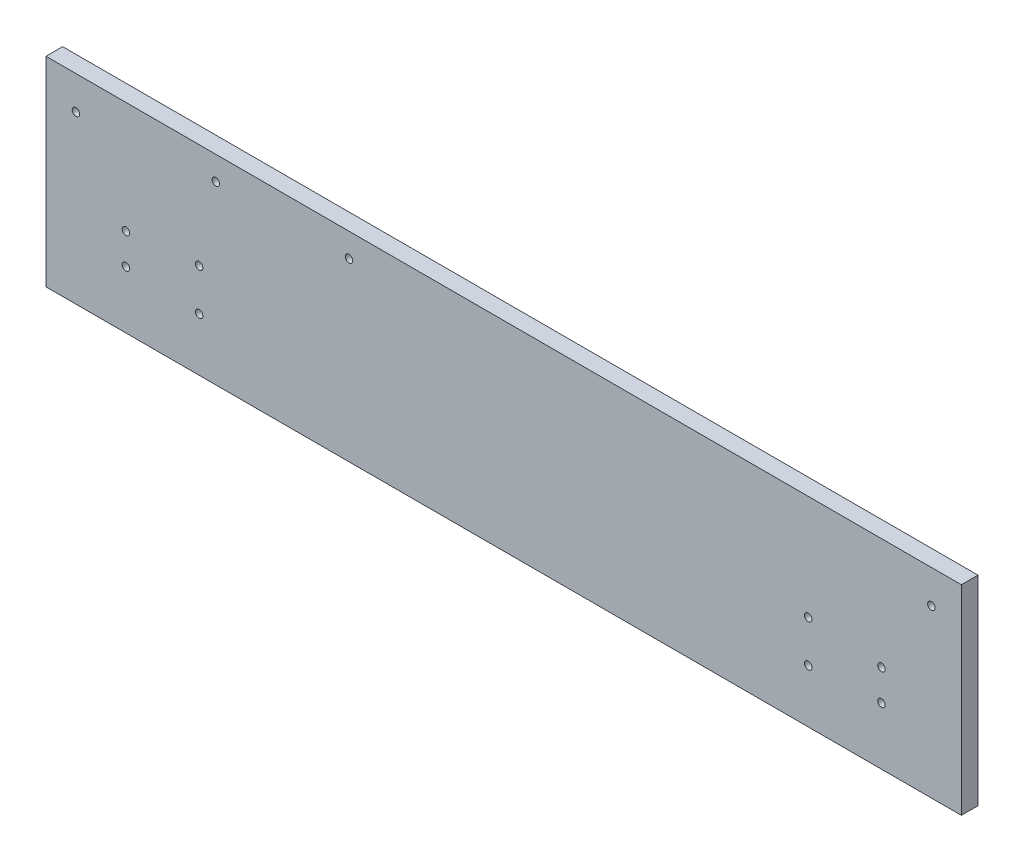
ISO-10303-21;
HEADER;
FILE_DESCRIPTION(('STEP AP214'),'2;1');
FILE_NAME('part.step','',(''),(''),'','','');
FILE_SCHEMA(('AUTOMOTIVE_DESIGN { 1 0 10303 214 1 1 1 1 }'));
ENDSEC;
DATA;
#1=APPLICATION_CONTEXT('core data for automotive mechanical design processes');
#2=APPLICATION_PROTOCOL_DEFINITION('international standard','automotive_design',2000,#1);
#3=PRODUCT_CONTEXT('',#1,'mechanical');
#4=PRODUCT('Part','Part','',(#3));
#5=PRODUCT_RELATED_PRODUCT_CATEGORY('part','',(#4));
#6=PRODUCT_DEFINITION_FORMATION('','',#4);
#7=PRODUCT_DEFINITION_CONTEXT('part definition',#1,'design');
#8=PRODUCT_DEFINITION('design','',#6,#7);
#9=PRODUCT_DEFINITION_SHAPE('','',#8);
#10=(LENGTH_UNIT() NAMED_UNIT(*) SI_UNIT(.MILLI.,.METRE.));
#11=(NAMED_UNIT(*) PLANE_ANGLE_UNIT() SI_UNIT($,.RADIAN.));
#12=(NAMED_UNIT(*) SI_UNIT($,.STERADIAN.) SOLID_ANGLE_UNIT());
#13=UNCERTAINTY_MEASURE_WITH_UNIT(LENGTH_MEASURE(1.E-05),#10,'distance_accuracy_value','');
#14=(GEOMETRIC_REPRESENTATION_CONTEXT(3) GLOBAL_UNCERTAINTY_ASSIGNED_CONTEXT((#13)) GLOBAL_UNIT_ASSIGNED_CONTEXT((#10,
#11,#12)) REPRESENTATION_CONTEXT('',''));
#15=CARTESIAN_POINT('',(0.,0.,0.));
#16=DIRECTION('',(0.,0.,1.));
#17=DIRECTION('',(1.,0.,0.));
#18=AXIS2_PLACEMENT_3D('',#15,#16,#17);
#19=CARTESIAN_POINT('',(-275.,60.,10.));
#20=DIRECTION('',(1.,0.,0.));
#21=DIRECTION('',(0.,0.,-1.));
#22=AXIS2_PLACEMENT_3D('',#19,#20,#21);
#23=PLANE('',#22);
#24=DIRECTION('',(0.,-1.,0.));
#25=VECTOR('',#24,1.);
#26=CARTESIAN_POINT('',(-275.,60.,0.));
#27=LINE('',#26,#25);
#28=CARTESIAN_POINT('',(-275.,60.,0.));
#29=VERTEX_POINT('',#28);
#30=CARTESIAN_POINT('',(-275.,-60.,0.));
#31=VERTEX_POINT('',#30);
#32=EDGE_CURVE('E100',#29,#31,#27,.T.);
#33=ORIENTED_EDGE('',*,*,#32,.T.);
#34=DIRECTION('',(0.,0.,-1.));
#35=VECTOR('',#34,1.);
#36=CARTESIAN_POINT('',(-275.,-60.,10.));
#37=LINE('',#36,#35);
#38=CARTESIAN_POINT('',(-275.,-60.,10.));
#39=VERTEX_POINT('',#38);
#40=EDGE_CURVE('E11',#39,#31,#37,.T.);
#41=ORIENTED_EDGE('',*,*,#40,.F.);
#42=DIRECTION('',(0.,-1.,0.));
#43=VECTOR('',#42,1.);
#44=CARTESIAN_POINT('',(-275.,60.,10.));
#45=LINE('',#44,#43);
#46=CARTESIAN_POINT('',(-275.,60.,10.));
#47=VERTEX_POINT('',#46);
#48=EDGE_CURVE('E88',#47,#39,#45,.T.);
#49=ORIENTED_EDGE('',*,*,#48,.F.);
#50=DIRECTION('',(0.,0.,-1.));
#51=VECTOR('',#50,1.);
#52=CARTESIAN_POINT('',(-275.,60.,10.));
#53=LINE('',#52,#51);
#54=EDGE_CURVE('E96',#47,#29,#53,.T.);
#55=ORIENTED_EDGE('',*,*,#54,.T.);
#56=EDGE_LOOP('',(#33,#41,#49,#55));
#57=FACE_BOUND('',#56,.T.);
#58=ADVANCED_FACE('F37',(#57),#23,.F.);
#59=CARTESIAN_POINT('',(-275.,-60.,10.));
#60=DIRECTION('',(0.,1.,0.));
#61=DIRECTION('',(0.,0.,1.));
#62=AXIS2_PLACEMENT_3D('',#59,#60,#61);
#63=PLANE('',#62);
#64=DIRECTION('',(1.,0.,0.));
#65=VECTOR('',#64,1.);
#66=CARTESIAN_POINT('',(-275.,-60.,0.));
#67=LINE('',#66,#65);
#68=CARTESIAN_POINT('',(275.,-60.,0.));
#69=VERTEX_POINT('',#68);
#70=EDGE_CURVE('E92',#31,#69,#67,.T.);
#71=ORIENTED_EDGE('',*,*,#70,.T.);
#72=DIRECTION('',(0.,0.,-1.));
#73=VECTOR('',#72,1.);
#74=CARTESIAN_POINT('',(275.,-60.,10.));
#75=LINE('',#74,#73);
#76=CARTESIAN_POINT('',(275.,-60.,10.));
#77=VERTEX_POINT('',#76);
#78=EDGE_CURVE('E45',#77,#69,#75,.T.);
#79=ORIENTED_EDGE('',*,*,#78,.F.);
#80=DIRECTION('',(1.,0.,0.));
#81=VECTOR('',#80,1.);
#82=CARTESIAN_POINT('',(-275.,-60.,10.));
#83=LINE('',#82,#81);
#84=EDGE_CURVE('E83',#39,#77,#83,.T.);
#85=ORIENTED_EDGE('',*,*,#84,.F.);
#86=ORIENTED_EDGE('',*,*,#40,.T.);
#87=EDGE_LOOP('',(#71,#79,#85,#86));
#88=FACE_BOUND('',#87,.T.);
#89=ADVANCED_FACE('F91',(#88),#63,.F.);
#90=CARTESIAN_POINT('',(275.,60.,10.));
#91=DIRECTION('',(-1.,0.,0.));
#92=DIRECTION('',(0.,0.,1.));
#93=AXIS2_PLACEMENT_3D('',#90,#91,#92);
#94=PLANE('',#93);
#95=DIRECTION('',(0.,1.,0.));
#96=VECTOR('',#95,1.);
#97=CARTESIAN_POINT('',(275.,60.,0.));
#98=LINE('',#97,#96);
#99=CARTESIAN_POINT('',(275.,60.,0.));
#100=VERTEX_POINT('',#99);
#101=EDGE_CURVE('E70',#69,#100,#98,.T.);
#102=ORIENTED_EDGE('',*,*,#101,.T.);
#103=DIRECTION('',(0.,0.,-1.));
#104=VECTOR('',#103,1.);
#105=CARTESIAN_POINT('',(275.,60.,10.));
#106=LINE('',#105,#104);
#107=CARTESIAN_POINT('',(275.,60.,10.));
#108=VERTEX_POINT('',#107);
#109=EDGE_CURVE('E93',#108,#100,#106,.T.);
#110=ORIENTED_EDGE('',*,*,#109,.F.);
#111=DIRECTION('',(0.,1.,0.));
#112=VECTOR('',#111,1.);
#113=CARTESIAN_POINT('',(275.,60.,10.));
#114=LINE('',#113,#112);
#115=EDGE_CURVE('E86',#77,#108,#114,.T.);
#116=ORIENTED_EDGE('',*,*,#115,.F.);
#117=ORIENTED_EDGE('',*,*,#78,.T.);
#118=EDGE_LOOP('',(#102,#110,#116,#117));
#119=FACE_BOUND('',#118,.T.);
#120=ADVANCED_FACE('F94',(#119),#94,.F.);
#121=CARTESIAN_POINT('',(-275.,60.,10.));
#122=DIRECTION('',(0.,-1.,0.));
#123=DIRECTION('',(0.,0.,-1.));
#124=AXIS2_PLACEMENT_3D('',#121,#122,#123);
#125=PLANE('',#124);
#126=DIRECTION('',(-1.,0.,0.));
#127=VECTOR('',#126,1.);
#128=CARTESIAN_POINT('',(-275.,60.,0.));
#129=LINE('',#128,#127);
#130=EDGE_CURVE('E76',#100,#29,#129,.T.);
#131=ORIENTED_EDGE('',*,*,#130,.T.);
#132=ORIENTED_EDGE('',*,*,#54,.F.);
#133=DIRECTION('',(-1.,0.,0.));
#134=VECTOR('',#133,1.);
#135=CARTESIAN_POINT('',(-275.,60.,10.));
#136=LINE('',#135,#134);
#137=EDGE_CURVE('E53',#108,#47,#136,.T.);
#138=ORIENTED_EDGE('',*,*,#137,.F.);
#139=ORIENTED_EDGE('',*,*,#109,.T.);
#140=EDGE_LOOP('',(#131,#132,#138,#139));
#141=FACE_BOUND('',#140,.T.);
#142=ADVANCED_FACE('F108',(#141),#125,.F.);
#143=CARTESIAN_POINT('',(0.,0.,10.));
#144=DIRECTION('',(0.,0.,1.));
#145=DIRECTION('',(1.,0.,0.));
#146=AXIS2_PLACEMENT_3D('',#143,#144,#145);
#147=PLANE('',#146);
#148=CARTESIAN_POINT('',(183.,-3.,10.));
#149=DIRECTION('',(0.,0.,1.));
#150=DIRECTION('',(1.,0.,0.));
#151=AXIS2_PLACEMENT_3D('',#148,#149,#150);
#152=CIRCLE('',#151,2.25000000000001);
#153=CARTESIAN_POINT('',(185.25,-3.,10.));
#154=VERTEX_POINT('',#153);
#155=EDGE_CURVE('E171',#154,#154,#152,.T.);
#156=ORIENTED_EDGE('',*,*,#155,.F.);
#157=EDGE_LOOP('',(#156));
#158=FACE_BOUND('',#157,.T.);
#159=CARTESIAN_POINT('',(183.,-28.,10.));
#160=DIRECTION('',(0.,0.,1.));
#161=DIRECTION('',(1.,0.,0.));
#162=AXIS2_PLACEMENT_3D('',#159,#160,#161);
#163=CIRCLE('',#162,2.25000000000001);
#164=CARTESIAN_POINT('',(185.25,-28.,10.));
#165=VERTEX_POINT('',#164);
#166=EDGE_CURVE('E177',#165,#165,#163,.T.);
#167=ORIENTED_EDGE('',*,*,#166,.F.);
#168=EDGE_LOOP('',(#167));
#169=FACE_BOUND('',#168,.T.);
#170=CARTESIAN_POINT('',(-183.,-28.,10.));
#171=DIRECTION('',(0.,0.,1.));
#172=DIRECTION('',(1.,0.,0.));
#173=AXIS2_PLACEMENT_3D('',#170,#171,#172);
#174=CIRCLE('',#173,2.25000000000001);
#175=CARTESIAN_POINT('',(-180.75,-28.,10.));
#176=VERTEX_POINT('',#175);
#177=EDGE_CURVE('E165',#176,#176,#174,.T.);
#178=ORIENTED_EDGE('',*,*,#177,.F.);
#179=EDGE_LOOP('',(#178));
#180=FACE_BOUND('',#179,.T.);
#181=CARTESIAN_POINT('',(-183.,-3.,10.));
#182=DIRECTION('',(0.,0.,1.));
#183=DIRECTION('',(1.,0.,0.));
#184=AXIS2_PLACEMENT_3D('',#181,#182,#183);
#185=CIRCLE('',#184,2.25000000000001);
#186=CARTESIAN_POINT('',(-180.75,-3.,10.));
#187=VERTEX_POINT('',#186);
#188=EDGE_CURVE('E162',#187,#187,#185,.T.);
#189=ORIENTED_EDGE('',*,*,#188,.F.);
#190=EDGE_LOOP('',(#189));
#191=FACE_BOUND('',#190,.T.);
#192=CARTESIAN_POINT('',(257.,40.0000000000025,10.));
#193=DIRECTION('',(0.,0.,-1.));
#194=DIRECTION('',(-1.,0.,0.));
#195=AXIS2_PLACEMENT_3D('',#192,#193,#194);
#196=CIRCLE('',#195,2.24999999999995);
#197=CARTESIAN_POINT('',(254.75,40.0000000000025,10.));
#198=VERTEX_POINT('',#197);
#199=EDGE_CURVE('E132',#198,#198,#196,.T.);
#200=ORIENTED_EDGE('',*,*,#199,.T.);
#201=EDGE_LOOP('',(#200));
#202=FACE_BOUND('',#201,.T.);
#203=CARTESIAN_POINT('',(-227.,-25.5,10.));
#204=DIRECTION('',(0.,0.,-1.));
#205=DIRECTION('',(-1.,0.,0.));
#206=AXIS2_PLACEMENT_3D('',#203,#204,#205);
#207=CIRCLE('',#206,2.25000000000001);
#208=CARTESIAN_POINT('',(-229.25,-25.5,10.));
#209=VERTEX_POINT('',#208);
#210=EDGE_CURVE('E139',#209,#209,#207,.T.);
#211=ORIENTED_EDGE('',*,*,#210,.T.);
#212=EDGE_LOOP('',(#211));
#213=FACE_BOUND('',#212,.T.);
#214=CARTESIAN_POINT('',(-227.,-6.99999999999999,10.));
#215=DIRECTION('',(0.,0.,-1.));
#216=DIRECTION('',(-1.,0.,0.));
#217=AXIS2_PLACEMENT_3D('',#214,#215,#216);
#218=CIRCLE('',#217,2.25000000000001);
#219=CARTESIAN_POINT('',(-229.25,-6.99999999999999,10.));
#220=VERTEX_POINT('',#219);
#221=EDGE_CURVE('E120',#220,#220,#218,.T.);
#222=ORIENTED_EDGE('',*,*,#221,.T.);
#223=EDGE_LOOP('',(#222));
#224=FACE_BOUND('',#223,.T.);
#225=CARTESIAN_POINT('',(227.,-25.5,10.));
#226=DIRECTION('',(0.,0.,-1.));
#227=DIRECTION('',(-1.,0.,0.));
#228=AXIS2_PLACEMENT_3D('',#225,#226,#227);
#229=CIRCLE('',#228,2.25000000000001);
#230=CARTESIAN_POINT('',(224.75,-25.5,10.));
#231=VERTEX_POINT('',#230);
#232=EDGE_CURVE('E127',#231,#231,#229,.T.);
#233=ORIENTED_EDGE('',*,*,#232,.T.);
#234=EDGE_LOOP('',(#233));
#235=FACE_BOUND('',#234,.T.);
#236=CARTESIAN_POINT('',(-172.925688,45.6999999999998,10.));
#237=DIRECTION('',(0.,0.,-1.));
#238=DIRECTION('',(-1.,0.,0.));
#239=AXIS2_PLACEMENT_3D('',#236,#237,#238);
#240=CIRCLE('',#239,2.25000000000001);
#241=CARTESIAN_POINT('',(-175.175688,45.6999999999998,10.));
#242=VERTEX_POINT('',#241);
#243=EDGE_CURVE('E156',#242,#242,#240,.T.);
#244=ORIENTED_EDGE('',*,*,#243,.T.);
#245=EDGE_LOOP('',(#244));
#246=FACE_BOUND('',#245,.T.);
#247=CARTESIAN_POINT('',(-92.9256880000001,45.6999999999998,10.));
#248=DIRECTION('',(0.,0.,-1.));
#249=DIRECTION('',(-1.,0.,0.));
#250=AXIS2_PLACEMENT_3D('',#247,#248,#249);
#251=CIRCLE('',#250,2.25);
#252=CARTESIAN_POINT('',(-95.1756880000001,45.6999999999998,10.));
#253=VERTEX_POINT('',#252);
#254=EDGE_CURVE('E144',#253,#253,#251,.T.);
#255=ORIENTED_EDGE('',*,*,#254,.T.);
#256=EDGE_LOOP('',(#255));
#257=FACE_BOUND('',#256,.T.);
#258=CARTESIAN_POINT('',(-257.,40.0000000000002,10.));
#259=DIRECTION('',(0.,0.,-1.));
#260=DIRECTION('',(-1.,0.,0.));
#261=AXIS2_PLACEMENT_3D('',#258,#259,#260);
#262=CIRCLE('',#261,2.24999999999995);
#263=CARTESIAN_POINT('',(-259.25,40.0000000000002,10.));
#264=VERTEX_POINT('',#263);
#265=EDGE_CURVE('E151',#264,#264,#262,.T.);
#266=ORIENTED_EDGE('',*,*,#265,.T.);
#267=EDGE_LOOP('',(#266));
#268=FACE_BOUND('',#267,.T.);
#269=CARTESIAN_POINT('',(227.,-6.99999999999999,10.));
#270=DIRECTION('',(0.,0.,-1.));
#271=DIRECTION('',(-1.,0.,0.));
#272=AXIS2_PLACEMENT_3D('',#269,#270,#271);
#273=CIRCLE('',#272,2.25000000000001);
#274=CARTESIAN_POINT('',(224.75,-6.99999999999999,10.));
#275=VERTEX_POINT('',#274);
#276=EDGE_CURVE('E103',#275,#275,#273,.T.);
#277=ORIENTED_EDGE('',*,*,#276,.T.);
#278=EDGE_LOOP('',(#277));
#279=FACE_BOUND('',#278,.T.);
#280=ORIENTED_EDGE('',*,*,#48,.T.);
#281=ORIENTED_EDGE('',*,*,#84,.T.);
#282=ORIENTED_EDGE('',*,*,#115,.T.);
#283=ORIENTED_EDGE('',*,*,#137,.T.);
#284=EDGE_LOOP('',(#280,#281,#282,#283));
#285=FACE_BOUND('',#284,.T.);
#286=ADVANCED_FACE('F84',(#158,#169,#180,#191,#202,#213,#224,#235,#246,#257,#268,#279,#285),
#147,.T.);
#287=CARTESIAN_POINT('',(0.,0.,0.));
#288=DIRECTION('',(0.,0.,1.));
#289=DIRECTION('',(1.,0.,0.));
#290=AXIS2_PLACEMENT_3D('',#287,#288,#289);
#291=PLANE('',#290);
#292=CARTESIAN_POINT('',(183.,-3.,0.));
#293=DIRECTION('',(0.,0.,1.));
#294=DIRECTION('',(1.,0.,0.));
#295=AXIS2_PLACEMENT_3D('',#292,#293,#294);
#296=CIRCLE('',#295,2.25000000000001);
#297=CARTESIAN_POINT('',(185.25,-3.,0.));
#298=VERTEX_POINT('',#297);
#299=EDGE_CURVE('E168',#298,#298,#296,.T.);
#300=ORIENTED_EDGE('',*,*,#299,.T.);
#301=EDGE_LOOP('',(#300));
#302=FACE_BOUND('',#301,.T.);
#303=CARTESIAN_POINT('',(183.,-28.,0.));
#304=DIRECTION('',(0.,0.,1.));
#305=DIRECTION('',(1.,0.,0.));
#306=AXIS2_PLACEMENT_3D('',#303,#304,#305);
#307=CIRCLE('',#306,2.25000000000001);
#308=CARTESIAN_POINT('',(185.25,-28.,0.));
#309=VERTEX_POINT('',#308);
#310=EDGE_CURVE('E174',#309,#309,#307,.T.);
#311=ORIENTED_EDGE('',*,*,#310,.T.);
#312=EDGE_LOOP('',(#311));
#313=FACE_BOUND('',#312,.T.);
#314=CARTESIAN_POINT('',(-183.,-28.,0.));
#315=DIRECTION('',(0.,0.,1.));
#316=DIRECTION('',(1.,0.,0.));
#317=AXIS2_PLACEMENT_3D('',#314,#315,#316);
#318=CIRCLE('',#317,2.25000000000001);
#319=CARTESIAN_POINT('',(-180.75,-28.,0.));
#320=VERTEX_POINT('',#319);
#321=EDGE_CURVE('E180',#320,#320,#318,.T.);
#322=ORIENTED_EDGE('',*,*,#321,.T.);
#323=EDGE_LOOP('',(#322));
#324=FACE_BOUND('',#323,.T.);
#325=CARTESIAN_POINT('',(-183.,-3.,0.));
#326=DIRECTION('',(0.,0.,1.));
#327=DIRECTION('',(1.,0.,0.));
#328=AXIS2_PLACEMENT_3D('',#325,#326,#327);
#329=CIRCLE('',#328,2.25000000000001);
#330=CARTESIAN_POINT('',(-180.75,-3.,0.));
#331=VERTEX_POINT('',#330);
#332=EDGE_CURVE('E159',#331,#331,#329,.T.);
#333=ORIENTED_EDGE('',*,*,#332,.T.);
#334=EDGE_LOOP('',(#333));
#335=FACE_BOUND('',#334,.T.);
#336=CARTESIAN_POINT('',(257.,40.0000000000025,0.));
#337=DIRECTION('',(0.,0.,-1.));
#338=DIRECTION('',(-1.,0.,0.));
#339=AXIS2_PLACEMENT_3D('',#336,#337,#338);
#340=CIRCLE('',#339,2.24999999999995);
#341=CARTESIAN_POINT('',(254.75,40.0000000000025,0.));
#342=VERTEX_POINT('',#341);
#343=EDGE_CURVE('E135',#342,#342,#340,.T.);
#344=ORIENTED_EDGE('',*,*,#343,.F.);
#345=EDGE_LOOP('',(#344));
#346=FACE_BOUND('',#345,.T.);
#347=CARTESIAN_POINT('',(-227.,-25.5,0.));
#348=DIRECTION('',(0.,0.,-1.));
#349=DIRECTION('',(-1.,0.,0.));
#350=AXIS2_PLACEMENT_3D('',#347,#348,#349);
#351=CIRCLE('',#350,2.25000000000001);
#352=CARTESIAN_POINT('',(-229.25,-25.5,0.));
#353=VERTEX_POINT('',#352);
#354=EDGE_CURVE('E124',#353,#353,#351,.T.);
#355=ORIENTED_EDGE('',*,*,#354,.F.);
#356=EDGE_LOOP('',(#355));
#357=FACE_BOUND('',#356,.T.);
#358=CARTESIAN_POINT('',(-227.,-6.99999999999999,0.));
#359=DIRECTION('',(0.,0.,-1.));
#360=DIRECTION('',(-1.,0.,0.));
#361=AXIS2_PLACEMENT_3D('',#358,#359,#360);
#362=CIRCLE('',#361,2.25000000000001);
#363=CARTESIAN_POINT('',(-229.25,-6.99999999999999,0.));
#364=VERTEX_POINT('',#363);
#365=EDGE_CURVE('E123',#364,#364,#362,.T.);
#366=ORIENTED_EDGE('',*,*,#365,.F.);
#367=EDGE_LOOP('',(#366));
#368=FACE_BOUND('',#367,.T.);
#369=CARTESIAN_POINT('',(227.,-25.5,0.));
#370=DIRECTION('',(0.,0.,-1.));
#371=DIRECTION('',(-1.,0.,0.));
#372=AXIS2_PLACEMENT_3D('',#369,#370,#371);
#373=CIRCLE('',#372,2.25000000000001);
#374=CARTESIAN_POINT('',(224.75,-25.5,0.));
#375=VERTEX_POINT('',#374);
#376=EDGE_CURVE('E117',#375,#375,#373,.T.);
#377=ORIENTED_EDGE('',*,*,#376,.F.);
#378=EDGE_LOOP('',(#377));
#379=FACE_BOUND('',#378,.T.);
#380=CARTESIAN_POINT('',(-172.925688,45.6999999999998,0.));
#381=DIRECTION('',(0.,0.,-1.));
#382=DIRECTION('',(-1.,0.,0.));
#383=AXIS2_PLACEMENT_3D('',#380,#381,#382);
#384=CIRCLE('',#383,2.25000000000001);
#385=CARTESIAN_POINT('',(-175.175688,45.6999999999998,0.));
#386=VERTEX_POINT('',#385);
#387=EDGE_CURVE('E148',#386,#386,#384,.T.);
#388=ORIENTED_EDGE('',*,*,#387,.F.);
#389=EDGE_LOOP('',(#388));
#390=FACE_BOUND('',#389,.T.);
#391=CARTESIAN_POINT('',(-92.9256880000001,45.6999999999998,0.));
#392=DIRECTION('',(0.,0.,-1.));
#393=DIRECTION('',(-1.,0.,0.));
#394=AXIS2_PLACEMENT_3D('',#391,#392,#393);
#395=CIRCLE('',#394,2.25);
#396=CARTESIAN_POINT('',(-95.1756880000001,45.6999999999998,0.));
#397=VERTEX_POINT('',#396);
#398=EDGE_CURVE('E147',#397,#397,#395,.T.);
#399=ORIENTED_EDGE('',*,*,#398,.F.);
#400=EDGE_LOOP('',(#399));
#401=FACE_BOUND('',#400,.T.);
#402=CARTESIAN_POINT('',(-257.,40.0000000000002,0.));
#403=DIRECTION('',(0.,0.,-1.));
#404=DIRECTION('',(-1.,0.,0.));
#405=AXIS2_PLACEMENT_3D('',#402,#403,#404);
#406=CIRCLE('',#405,2.24999999999995);
#407=CARTESIAN_POINT('',(-259.25,40.0000000000002,0.));
#408=VERTEX_POINT('',#407);
#409=EDGE_CURVE('E136',#408,#408,#406,.T.);
#410=ORIENTED_EDGE('',*,*,#409,.F.);
#411=EDGE_LOOP('',(#410));
#412=FACE_BOUND('',#411,.T.);
#413=CARTESIAN_POINT('',(227.,-6.99999999999999,0.));
#414=DIRECTION('',(0.,0.,-1.));
#415=DIRECTION('',(-1.,0.,0.));
#416=AXIS2_PLACEMENT_3D('',#413,#414,#415);
#417=CIRCLE('',#416,2.25000000000001);
#418=CARTESIAN_POINT('',(224.75,-6.99999999999999,0.));
#419=VERTEX_POINT('',#418);
#420=EDGE_CURVE('E114',#419,#419,#417,.T.);
#421=ORIENTED_EDGE('',*,*,#420,.F.);
#422=EDGE_LOOP('',(#421));
#423=FACE_BOUND('',#422,.T.);
#424=ORIENTED_EDGE('',*,*,#32,.F.);
#425=ORIENTED_EDGE('',*,*,#130,.F.);
#426=ORIENTED_EDGE('',*,*,#101,.F.);
#427=ORIENTED_EDGE('',*,*,#70,.F.);
#428=EDGE_LOOP('',(#424,#425,#426,#427));
#429=FACE_BOUND('',#428,.T.);
#430=ADVANCED_FACE('F111',(#302,#313,#324,#335,#346,#357,#368,#379,#390,#401,#412,#423,#429),
#291,.F.);
#431=CARTESIAN_POINT('',(227.,-6.99999999999999,10.));
#432=DIRECTION('',(0.,0.,-1.));
#433=DIRECTION('',(-1.,0.,0.));
#434=AXIS2_PLACEMENT_3D('',#431,#432,#433);
#435=CYLINDRICAL_SURFACE('',#434,2.25000000000001);
#436=ORIENTED_EDGE('',*,*,#276,.F.);
#437=EDGE_LOOP('',(#436));
#438=FACE_BOUND('',#437,.T.);
#439=ORIENTED_EDGE('',*,*,#420,.T.);
#440=EDGE_LOOP('',(#439));
#441=FACE_BOUND('',#440,.T.);
#442=ADVANCED_FACE('F210',(#438,#441),#435,.F.);
#443=CARTESIAN_POINT('',(-257.,40.0000000000002,10.));
#444=DIRECTION('',(0.,0.,-1.));
#445=DIRECTION('',(-1.,0.,0.));
#446=AXIS2_PLACEMENT_3D('',#443,#444,#445);
#447=CYLINDRICAL_SURFACE('',#446,2.24999999999995);
#448=ORIENTED_EDGE('',*,*,#265,.F.);
#449=EDGE_LOOP('',(#448));
#450=FACE_BOUND('',#449,.T.);
#451=ORIENTED_EDGE('',*,*,#409,.T.);
#452=EDGE_LOOP('',(#451));
#453=FACE_BOUND('',#452,.T.);
#454=ADVANCED_FACE('F213',(#450,#453),#447,.F.);
#455=CARTESIAN_POINT('',(-92.9256880000001,45.6999999999998,10.));
#456=DIRECTION('',(0.,0.,-1.));
#457=DIRECTION('',(-1.,0.,0.));
#458=AXIS2_PLACEMENT_3D('',#455,#456,#457);
#459=CYLINDRICAL_SURFACE('',#458,2.25);
#460=ORIENTED_EDGE('',*,*,#254,.F.);
#461=EDGE_LOOP('',(#460));
#462=FACE_BOUND('',#461,.T.);
#463=ORIENTED_EDGE('',*,*,#398,.T.);
#464=EDGE_LOOP('',(#463));
#465=FACE_BOUND('',#464,.T.);
#466=ADVANCED_FACE('F347',(#462,#465),#459,.F.);
#467=CARTESIAN_POINT('',(-172.925688,45.6999999999998,10.));
#468=DIRECTION('',(0.,0.,-1.));
#469=DIRECTION('',(-1.,0.,0.));
#470=AXIS2_PLACEMENT_3D('',#467,#468,#469);
#471=CYLINDRICAL_SURFACE('',#470,2.25000000000001);
#472=ORIENTED_EDGE('',*,*,#243,.F.);
#473=EDGE_LOOP('',(#472));
#474=FACE_BOUND('',#473,.T.);
#475=ORIENTED_EDGE('',*,*,#387,.T.);
#476=EDGE_LOOP('',(#475));
#477=FACE_BOUND('',#476,.T.);
#478=ADVANCED_FACE('F337',(#474,#477),#471,.F.);
#479=CARTESIAN_POINT('',(227.,-25.5,10.));
#480=DIRECTION('',(0.,0.,-1.));
#481=DIRECTION('',(-1.,0.,0.));
#482=AXIS2_PLACEMENT_3D('',#479,#480,#481);
#483=CYLINDRICAL_SURFACE('',#482,2.25000000000001);
#484=ORIENTED_EDGE('',*,*,#232,.F.);
#485=EDGE_LOOP('',(#484));
#486=FACE_BOUND('',#485,.T.);
#487=ORIENTED_EDGE('',*,*,#376,.T.);
#488=EDGE_LOOP('',(#487));
#489=FACE_BOUND('',#488,.T.);
#490=ADVANCED_FACE('F327',(#486,#489),#483,.F.);
#491=CARTESIAN_POINT('',(-227.,-6.99999999999999,10.));
#492=DIRECTION('',(0.,0.,-1.));
#493=DIRECTION('',(-1.,0.,0.));
#494=AXIS2_PLACEMENT_3D('',#491,#492,#493);
#495=CYLINDRICAL_SURFACE('',#494,2.25000000000001);
#496=ORIENTED_EDGE('',*,*,#221,.F.);
#497=EDGE_LOOP('',(#496));
#498=FACE_BOUND('',#497,.T.);
#499=ORIENTED_EDGE('',*,*,#365,.T.);
#500=EDGE_LOOP('',(#499));
#501=FACE_BOUND('',#500,.T.);
#502=ADVANCED_FACE('F318',(#498,#501),#495,.F.);
#503=CARTESIAN_POINT('',(-227.,-25.5,10.));
#504=DIRECTION('',(0.,0.,-1.));
#505=DIRECTION('',(-1.,0.,0.));
#506=AXIS2_PLACEMENT_3D('',#503,#504,#505);
#507=CYLINDRICAL_SURFACE('',#506,2.25000000000001);
#508=ORIENTED_EDGE('',*,*,#210,.F.);
#509=EDGE_LOOP('',(#508));
#510=FACE_BOUND('',#509,.T.);
#511=ORIENTED_EDGE('',*,*,#354,.T.);
#512=EDGE_LOOP('',(#511));
#513=FACE_BOUND('',#512,.T.);
#514=ADVANCED_FACE('F309',(#510,#513),#507,.F.);
#515=CARTESIAN_POINT('',(257.,40.0000000000025,10.));
#516=DIRECTION('',(0.,0.,-1.));
#517=DIRECTION('',(-1.,0.,0.));
#518=AXIS2_PLACEMENT_3D('',#515,#516,#517);
#519=CYLINDRICAL_SURFACE('',#518,2.24999999999995);
#520=ORIENTED_EDGE('',*,*,#199,.F.);
#521=EDGE_LOOP('',(#520));
#522=FACE_BOUND('',#521,.T.);
#523=ORIENTED_EDGE('',*,*,#343,.T.);
#524=EDGE_LOOP('',(#523));
#525=FACE_BOUND('',#524,.T.);
#526=ADVANCED_FACE('F249',(#522,#525),#519,.F.);
#527=CARTESIAN_POINT('',(-183.,-3.,0.));
#528=DIRECTION('',(0.,0.,1.));
#529=DIRECTION('',(1.,0.,0.));
#530=AXIS2_PLACEMENT_3D('',#527,#528,#529);
#531=CYLINDRICAL_SURFACE('',#530,2.25000000000001);
#532=ORIENTED_EDGE('',*,*,#332,.F.);
#533=EDGE_LOOP('',(#532));
#534=FACE_BOUND('',#533,.T.);
#535=ORIENTED_EDGE('',*,*,#188,.T.);
#536=EDGE_LOOP('',(#535));
#537=FACE_BOUND('',#536,.T.);
#538=ADVANCED_FACE('F260',(#534,#537),#531,.F.);
#539=CARTESIAN_POINT('',(-183.,-28.,0.));
#540=DIRECTION('',(0.,0.,1.));
#541=DIRECTION('',(1.,0.,0.));
#542=AXIS2_PLACEMENT_3D('',#539,#540,#541);
#543=CYLINDRICAL_SURFACE('',#542,2.25000000000001);
#544=ORIENTED_EDGE('',*,*,#321,.F.);
#545=EDGE_LOOP('',(#544));
#546=FACE_BOUND('',#545,.T.);
#547=ORIENTED_EDGE('',*,*,#177,.T.);
#548=EDGE_LOOP('',(#547));
#549=FACE_BOUND('',#548,.T.);
#550=ADVANCED_FACE('F186',(#546,#549),#543,.F.);
#551=CARTESIAN_POINT('',(183.,-28.,0.));
#552=DIRECTION('',(0.,0.,1.));
#553=DIRECTION('',(1.,0.,0.));
#554=AXIS2_PLACEMENT_3D('',#551,#552,#553);
#555=CYLINDRICAL_SURFACE('',#554,2.25000000000001);
#556=ORIENTED_EDGE('',*,*,#310,.F.);
#557=EDGE_LOOP('',(#556));
#558=FACE_BOUND('',#557,.T.);
#559=ORIENTED_EDGE('',*,*,#166,.T.);
#560=EDGE_LOOP('',(#559));
#561=FACE_BOUND('',#560,.T.);
#562=ADVANCED_FACE('F275',(#558,#561),#555,.F.);
#563=CARTESIAN_POINT('',(183.,-3.,0.));
#564=DIRECTION('',(0.,0.,1.));
#565=DIRECTION('',(1.,0.,0.));
#566=AXIS2_PLACEMENT_3D('',#563,#564,#565);
#567=CYLINDRICAL_SURFACE('',#566,2.25000000000001);
#568=ORIENTED_EDGE('',*,*,#299,.F.);
#569=EDGE_LOOP('',(#568));
#570=FACE_BOUND('',#569,.T.);
#571=ORIENTED_EDGE('',*,*,#155,.T.);
#572=EDGE_LOOP('',(#571));
#573=FACE_BOUND('',#572,.T.);
#574=ADVANCED_FACE('F286',(#570,#573),#567,.F.);
#575=CLOSED_SHELL('',(#58,#89,#120,#142,#286,#430,#442,#454,#466,#478,#490,#502,#514,#526,#538,
#550,#562,#574));
#576=MANIFOLD_SOLID_BREP('B2',#575);
#577=ADVANCED_BREP_SHAPE_REPRESENTATION('',(#18,#576),#14);
#578=SHAPE_DEFINITION_REPRESENTATION(#9,#577);
ENDSEC;
END-ISO-10303-21;
